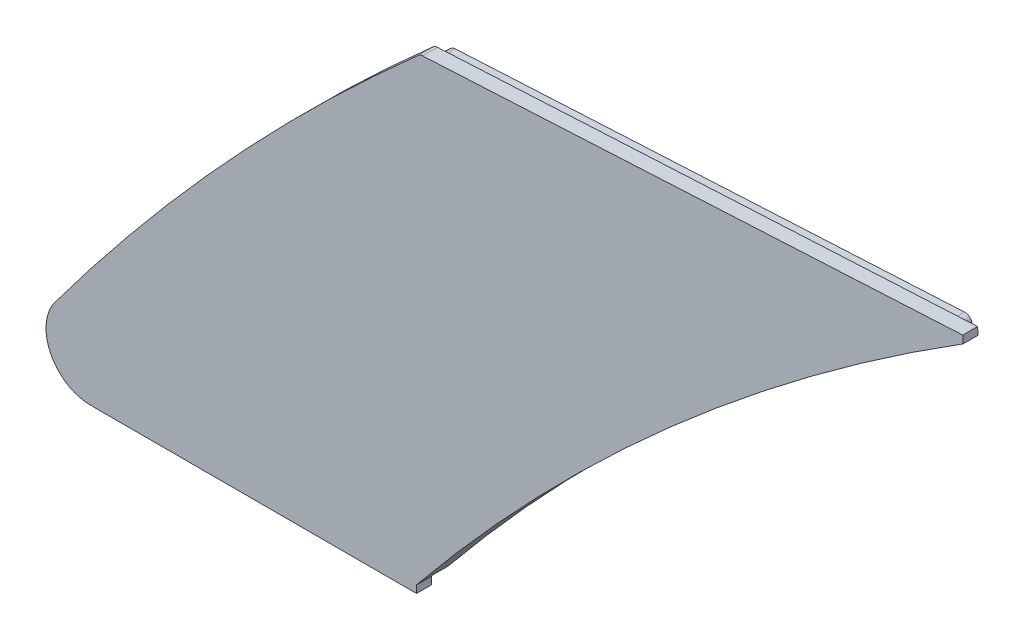
ISO-10303-21;
HEADER;
FILE_DESCRIPTION(('STEP AP214'),'2;1');
FILE_NAME('part.step','',(''),(''),'','','');
FILE_SCHEMA(('AUTOMOTIVE_DESIGN { 1 0 10303 214 1 1 1 1 }'));
ENDSEC;
DATA;
#1=APPLICATION_CONTEXT('core data for automotive mechanical design processes');
#2=APPLICATION_PROTOCOL_DEFINITION('international standard','automotive_design',2000,#1);
#3=PRODUCT_CONTEXT('',#1,'mechanical');
#4=PRODUCT('Part','Part','',(#3));
#5=PRODUCT_RELATED_PRODUCT_CATEGORY('part','',(#4));
#6=PRODUCT_DEFINITION_FORMATION('','',#4);
#7=PRODUCT_DEFINITION_CONTEXT('part definition',#1,'design');
#8=PRODUCT_DEFINITION('design','',#6,#7);
#9=PRODUCT_DEFINITION_SHAPE('','',#8);
#10=(LENGTH_UNIT() NAMED_UNIT(*) SI_UNIT(.MILLI.,.METRE.));
#11=(NAMED_UNIT(*) PLANE_ANGLE_UNIT() SI_UNIT($,.RADIAN.));
#12=(NAMED_UNIT(*) SI_UNIT($,.STERADIAN.) SOLID_ANGLE_UNIT());
#13=UNCERTAINTY_MEASURE_WITH_UNIT(LENGTH_MEASURE(1.E-05),#10,'distance_accuracy_value','');
#14=(GEOMETRIC_REPRESENTATION_CONTEXT(3) GLOBAL_UNCERTAINTY_ASSIGNED_CONTEXT((#13)) GLOBAL_UNIT_ASSIGNED_CONTEXT((#10,
#11,#12)) REPRESENTATION_CONTEXT('',''));
#15=CARTESIAN_POINT('',(0.,0.,0.));
#16=DIRECTION('',(0.,0.,1.));
#17=DIRECTION('',(1.,0.,0.));
#18=AXIS2_PLACEMENT_3D('',#15,#16,#17);
#19=CARTESIAN_POINT('',(232.70730230835,-252.33386240282,2.));
#20=DIRECTION('',(0.,0.,1.));
#21=DIRECTION('',(1.,0.,0.));
#22=AXIS2_PLACEMENT_3D('',#19,#20,#21);
#23=CYLINDRICAL_SURFACE('',#22,301.);
#24=DIRECTION('',(0.,0.,1.));
#25=VECTOR('',#24,1.);
#26=CARTESIAN_POINT('',(69.8249489380425,0.787331811631535,2.));
#27=LINE('',#26,#25);
#28=CARTESIAN_POINT('',(69.8249489380425,0.787331811631535,2.));
#29=VERTEX_POINT('',#28);
#30=CARTESIAN_POINT('',(69.8249489380425,0.787331811631535,4.));
#31=VERTEX_POINT('',#30);
#32=EDGE_CURVE('E36',#29,#31,#27,.T.);
#33=ORIENTED_EDGE('',*,*,#32,.T.);
#34=CARTESIAN_POINT('',(232.70730230835,-252.33386240282,4.));
#35=DIRECTION('',(0.,0.,-1.));
#36=DIRECTION('',(1.,0.,0.));
#37=AXIS2_PLACEMENT_3D('',#34,#35,#36);
#38=CIRCLE('',#37,301.);
#39=CARTESIAN_POINT('',(73.0381332700158,2.82639402166251,4.));
#40=VERTEX_POINT('',#39);
#41=EDGE_CURVE('E171',#31,#40,#38,.T.);
#42=ORIENTED_EDGE('',*,*,#41,.T.);
#43=DIRECTION('',(0.,0.,-1.));
#44=VECTOR('',#43,1.);
#45=CARTESIAN_POINT('',(73.0381332700158,2.82639402166251,6.));
#46=LINE('',#45,#44);
#47=CARTESIAN_POINT('',(73.0381332700158,2.82639402166251,6.));
#48=VERTEX_POINT('',#47);
#49=EDGE_CURVE('E227',#48,#40,#46,.T.);
#50=ORIENTED_EDGE('',*,*,#49,.F.);
#51=CARTESIAN_POINT('',(232.70730230835,-252.33386240282,6.));
#52=DIRECTION('',(0.,0.,-1.));
#53=DIRECTION('',(1.,0.,0.));
#54=AXIS2_PLACEMENT_3D('',#51,#52,#53);
#55=CIRCLE('',#54,301.);
#56=CARTESIAN_POINT('',(-0.475074433169964,-62.,6.));
#57=VERTEX_POINT('',#56);
#58=EDGE_CURVE('E205',#57,#48,#55,.T.);
#59=ORIENTED_EDGE('',*,*,#58,.F.);
#60=DIRECTION('',(0.,0.,-1.));
#61=VECTOR('',#60,1.);
#62=CARTESIAN_POINT('',(-0.475074433169964,-62.,6.));
#63=LINE('',#62,#61);
#64=CARTESIAN_POINT('',(-0.475074433169964,-62.,4.));
#65=VERTEX_POINT('',#64);
#66=EDGE_CURVE('E206',#57,#65,#63,.T.);
#67=ORIENTED_EDGE('',*,*,#66,.T.);
#68=CARTESIAN_POINT('',(-0.175485967712302,-61.633555835771,4.));
#69=VERTEX_POINT('',#68);
#70=EDGE_CURVE('E180',#65,#69,#38,.T.);
#71=ORIENTED_EDGE('',*,*,#70,.T.);
#72=DIRECTION('',(0.,0.,1.));
#73=VECTOR('',#72,1.);
#74=CARTESIAN_POINT('',(-0.175485967712354,-61.633555835771,2.));
#75=LINE('',#74,#73);
#76=CARTESIAN_POINT('',(-0.175485967712354,-61.633555835771,2.));
#77=VERTEX_POINT('',#76);
#78=EDGE_CURVE('E11',#77,#69,#75,.T.);
#79=ORIENTED_EDGE('',*,*,#78,.F.);
#80=CARTESIAN_POINT('',(232.70730230835,-252.33386240282,2.));
#81=DIRECTION('',(0.,0.,-1.));
#82=DIRECTION('',(1.,0.,0.));
#83=AXIS2_PLACEMENT_3D('',#80,#81,#82);
#84=CIRCLE('',#83,301.);
#85=EDGE_CURVE('E158',#77,#29,#84,.T.);
#86=ORIENTED_EDGE('',*,*,#85,.T.);
#87=EDGE_LOOP('',(#33,#42,#50,#59,#67,#71,#79,#86));
#88=FACE_BOUND('',#87,.T.);
#89=ADVANCED_FACE('F33',(#88),#23,.F.);
#90=CARTESIAN_POINT('',(-0.949182938729171,-61.,2.));
#91=DIRECTION('',(0.,0.,1.));
#92=DIRECTION('',(1.,0.,0.));
#93=AXIS2_PLACEMENT_3D('',#90,#91,#92);
#94=CYLINDRICAL_SURFACE('',#93,1.);
#95=CARTESIAN_POINT('',(-0.949182938729171,-61.,4.));
#96=DIRECTION('',(0.,0.,1.));
#97=DIRECTION('',(1.,0.,0.));
#98=AXIS2_PLACEMENT_3D('',#95,#96,#97);
#99=CIRCLE('',#98,1.);
#100=CARTESIAN_POINT('',(-0.949182938729171,-62.,4.));
#101=VERTEX_POINT('',#100);
#102=EDGE_CURVE('E156',#101,#69,#99,.T.);
#103=ORIENTED_EDGE('',*,*,#102,.F.);
#104=DIRECTION('',(0.,0.,1.));
#105=VECTOR('',#104,1.);
#106=CARTESIAN_POINT('',(-0.949182938729171,-62.,2.));
#107=LINE('',#106,#105);
#108=CARTESIAN_POINT('',(-0.949182938729171,-62.,2.));
#109=VERTEX_POINT('',#108);
#110=EDGE_CURVE('E41',#109,#101,#107,.T.);
#111=ORIENTED_EDGE('',*,*,#110,.F.);
#112=CARTESIAN_POINT('',(-0.949182938729171,-61.,2.));
#113=DIRECTION('',(0.,0.,1.));
#114=DIRECTION('',(1.,0.,0.));
#115=AXIS2_PLACEMENT_3D('',#112,#113,#114);
#116=CIRCLE('',#115,1.);
#117=EDGE_CURVE('E130',#109,#77,#116,.T.);
#118=ORIENTED_EDGE('',*,*,#117,.T.);
#119=ORIENTED_EDGE('',*,*,#78,.T.);
#120=EDGE_LOOP('',(#103,#111,#118,#119));
#121=FACE_BOUND('',#120,.T.);
#122=ADVANCED_FACE('F295',(#121),#94,.T.);
#123=CARTESIAN_POINT('',(-44.3054831138269,-62.,2.));
#124=DIRECTION('',(0.,-1.,0.));
#125=DIRECTION('',(0.,0.,-1.));
#126=AXIS2_PLACEMENT_3D('',#123,#124,#125);
#127=PLANE('',#126);
#128=DIRECTION('',(1.,0.,0.));
#129=VECTOR('',#128,1.);
#130=CARTESIAN_POINT('',(-44.3054831138269,-62.,4.));
#131=LINE('',#130,#129);
#132=CARTESIAN_POINT('',(-44.3054831138269,-62.,4.));
#133=VERTEX_POINT('',#132);
#134=EDGE_CURVE('E116',#133,#101,#131,.T.);
#135=ORIENTED_EDGE('',*,*,#134,.F.);
#136=DIRECTION('',(0.,0.,1.));
#137=VECTOR('',#136,1.);
#138=CARTESIAN_POINT('',(-44.3054831138269,-62.,2.));
#139=LINE('',#138,#137);
#140=CARTESIAN_POINT('',(-44.3054831138269,-62.,2.));
#141=VERTEX_POINT('',#140);
#142=EDGE_CURVE('E110',#141,#133,#139,.T.);
#143=ORIENTED_EDGE('',*,*,#142,.F.);
#144=DIRECTION('',(1.,0.,0.));
#145=VECTOR('',#144,1.);
#146=CARTESIAN_POINT('',(-44.3054831138269,-62.,2.));
#147=LINE('',#146,#145);
#148=EDGE_CURVE('E113',#141,#109,#147,.T.);
#149=ORIENTED_EDGE('',*,*,#148,.T.);
#150=ORIENTED_EDGE('',*,*,#110,.T.);
#151=EDGE_LOOP('',(#135,#143,#149,#150));
#152=FACE_BOUND('',#151,.T.);
#153=ADVANCED_FACE('F112',(#152),#127,.T.);
#154=CARTESIAN_POINT('',(-44.3054831138269,-57.,2.));
#155=DIRECTION('',(0.,0.,1.));
#156=DIRECTION('',(1.,0.,0.));
#157=AXIS2_PLACEMENT_3D('',#154,#155,#156);
#158=CYLINDRICAL_SURFACE('',#157,5.00000000000003);
#159=CARTESIAN_POINT('',(-44.3054831138269,-57.,4.));
#160=DIRECTION('',(0.,0.,1.));
#161=DIRECTION('',(1.,0.,0.));
#162=AXIS2_PLACEMENT_3D('',#159,#160,#161);
#163=CIRCLE('',#162,5.00000000000003);
#164=CARTESIAN_POINT('',(-48.3170422447712,-54.0154743527759,4.));
#165=VERTEX_POINT('',#164);
#166=EDGE_CURVE('E153',#165,#133,#163,.T.);
#167=ORIENTED_EDGE('',*,*,#166,.F.);
#168=DIRECTION('',(0.,0.,1.));
#169=VECTOR('',#168,1.);
#170=CARTESIAN_POINT('',(-48.3170422447712,-54.0154743527759,2.));
#171=LINE('',#170,#169);
#172=CARTESIAN_POINT('',(-48.3170422447712,-54.0154743527759,2.));
#173=VERTEX_POINT('',#172);
#174=EDGE_CURVE('E121',#173,#165,#171,.T.);
#175=ORIENTED_EDGE('',*,*,#174,.F.);
#176=CARTESIAN_POINT('',(-44.3054831138269,-57.,2.));
#177=DIRECTION('',(0.,0.,1.));
#178=DIRECTION('',(1.,0.,0.));
#179=AXIS2_PLACEMENT_3D('',#176,#177,#178);
#180=CIRCLE('',#179,5.00000000000003);
#181=EDGE_CURVE('E127',#173,#141,#180,.T.);
#182=ORIENTED_EDGE('',*,*,#181,.T.);
#183=ORIENTED_EDGE('',*,*,#142,.T.);
#184=EDGE_LOOP('',(#167,#175,#182,#183));
#185=FACE_BOUND('',#184,.T.);
#186=ADVANCED_FACE('F132',(#185),#158,.T.);
#187=CARTESIAN_POINT('',(231.689785095137,-262.335364529011,2.));
#188=DIRECTION('',(0.,0.,1.));
#189=DIRECTION('',(1.,0.,0.));
#190=AXIS2_PLACEMENT_3D('',#187,#188,#189);
#191=CYLINDRICAL_SURFACE('',#190,349.);
#192=CARTESIAN_POINT('',(231.689785095137,-262.335364529011,4.));
#193=DIRECTION('',(0.,0.,1.));
#194=DIRECTION('',(1.,0.,0.));
#195=AXIS2_PLACEMENT_3D('',#192,#193,#194);
#196=CIRCLE('',#195,349.);
#197=CARTESIAN_POINT('',(0.138825090473008,-1.21249513431716,4.));
#198=VERTEX_POINT('',#197);
#199=EDGE_CURVE('E150',#198,#165,#196,.T.);
#200=ORIENTED_EDGE('',*,*,#199,.F.);
#201=DIRECTION('',(0.,0.,1.));
#202=VECTOR('',#201,1.);
#203=CARTESIAN_POINT('',(0.138825090473008,-1.21249513431716,2.));
#204=LINE('',#203,#202);
#205=CARTESIAN_POINT('',(0.138825090473008,-1.21249513431716,2.));
#206=VERTEX_POINT('',#205);
#207=EDGE_CURVE('E162',#206,#198,#204,.T.);
#208=ORIENTED_EDGE('',*,*,#207,.F.);
#209=CARTESIAN_POINT('',(231.689785095137,-262.335364529011,2.));
#210=DIRECTION('',(0.,0.,1.));
#211=DIRECTION('',(1.,0.,0.));
#212=AXIS2_PLACEMENT_3D('',#209,#210,#211);
#213=CIRCLE('',#212,349.);
#214=EDGE_CURVE('E133',#206,#173,#213,.T.);
#215=ORIENTED_EDGE('',*,*,#214,.T.);
#216=ORIENTED_EDGE('',*,*,#174,.T.);
#217=EDGE_LOOP('',(#200,#208,#215,#216));
#218=FACE_BOUND('',#217,.T.);
#219=ADVANCED_FACE('F285',(#218),#191,.T.);
#220=CARTESIAN_POINT('',(0.802294889913291,-1.96069819848532,2.));
#221=DIRECTION('',(0.,0.,1.));
#222=DIRECTION('',(1.,0.,0.));
#223=AXIS2_PLACEMENT_3D('',#220,#221,#222);
#224=CYLINDRICAL_SURFACE('',#223,0.999999999999977);
#225=CARTESIAN_POINT('',(0.802294889913291,-1.96069819848532,4.));
#226=DIRECTION('',(0.,0.,1.));
#227=DIRECTION('',(1.,0.,0.));
#228=AXIS2_PLACEMENT_3D('',#225,#226,#227);
#229=CIRCLE('',#228,0.999999999999977);
#230=CARTESIAN_POINT('',(0.749958933670331,-0.962068663730781,4.));
#231=VERTEX_POINT('',#230);
#232=EDGE_CURVE('E147',#231,#198,#229,.T.);
#233=ORIENTED_EDGE('',*,*,#232,.F.);
#234=DIRECTION('',(0.,0.,1.));
#235=VECTOR('',#234,1.);
#236=CARTESIAN_POINT('',(0.749958933670331,-0.962068663730781,2.));
#237=LINE('',#236,#235);
#238=CARTESIAN_POINT('',(0.749958933670331,-0.962068663730781,2.));
#239=VERTEX_POINT('',#238);
#240=EDGE_CURVE('E164',#239,#231,#237,.T.);
#241=ORIENTED_EDGE('',*,*,#240,.F.);
#242=CARTESIAN_POINT('',(0.802294889913291,-1.96069819848532,2.));
#243=DIRECTION('',(0.,0.,1.));
#244=DIRECTION('',(1.,0.,0.));
#245=AXIS2_PLACEMENT_3D('',#242,#243,#244);
#246=CIRCLE('',#245,0.999999999999977);
#247=EDGE_CURVE('E135',#239,#206,#246,.T.);
#248=ORIENTED_EDGE('',*,*,#247,.T.);
#249=ORIENTED_EDGE('',*,*,#207,.T.);
#250=EDGE_LOOP('',(#233,#241,#248,#249));
#251=FACE_BOUND('',#250,.T.);
#252=ADVANCED_FACE('F279',(#251),#224,.T.);
#253=CARTESIAN_POINT('',(69.2314755951872,2.62689554643405,2.));
#254=DIRECTION('',(-0.052335956242946,0.998629534754574,0.));
#255=DIRECTION('',(-0.998629534754574,-0.052335956242946,0.));
#256=AXIS2_PLACEMENT_3D('',#253,#254,#255);
#257=PLANE('',#256);
#258=DIRECTION('',(-0.998629534754574,-0.052335956242946,0.));
#259=VECTOR('',#258,1.);
#260=CARTESIAN_POINT('',(69.2314755951872,2.62689554643405,4.));
#261=LINE('',#260,#259);
#262=CARTESIAN_POINT('',(69.2314755951872,2.62689554643402,4.));
#263=VERTEX_POINT('',#262);
#264=EDGE_CURVE('E143',#263,#231,#261,.T.);
#265=ORIENTED_EDGE('',*,*,#264,.F.);
#266=DIRECTION('',(0.,0.,1.));
#267=VECTOR('',#266,1.);
#268=CARTESIAN_POINT('',(69.2314755951872,2.62689554643402,2.));
#269=LINE('',#268,#267);
#270=CARTESIAN_POINT('',(69.2314755951872,2.62689554643402,2.));
#271=VERTEX_POINT('',#270);
#272=EDGE_CURVE('E165',#271,#263,#269,.T.);
#273=ORIENTED_EDGE('',*,*,#272,.F.);
#274=DIRECTION('',(-0.998629534754574,-0.052335956242946,0.));
#275=VECTOR('',#274,1.);
#276=CARTESIAN_POINT('',(69.2314755951872,2.62689554643405,2.));
#277=LINE('',#276,#275);
#278=EDGE_CURVE('E273',#271,#239,#277,.T.);
#279=ORIENTED_EDGE('',*,*,#278,.T.);
#280=ORIENTED_EDGE('',*,*,#240,.T.);
#281=EDGE_LOOP('',(#265,#273,#279,#280));
#282=FACE_BOUND('',#281,.T.);
#283=ADVANCED_FACE('F283',(#282),#257,.T.);
#284=CARTESIAN_POINT('',(69.2838115514302,1.6282660116795,2.));
#285=DIRECTION('',(0.,0.,1.));
#286=DIRECTION('',(1.,0.,0.));
#287=AXIS2_PLACEMENT_3D('',#284,#285,#286);
#288=CYLINDRICAL_SURFACE('',#287,0.999999999999949);
#289=CARTESIAN_POINT('',(69.2838115514302,1.6282660116795,4.));
#290=DIRECTION('',(0.,0.,1.));
#291=DIRECTION('',(1.,0.,0.));
#292=AXIS2_PLACEMENT_3D('',#289,#290,#291);
#293=CIRCLE('',#292,0.999999999999949);
#294=EDGE_CURVE('E140',#31,#263,#293,.T.);
#295=ORIENTED_EDGE('',*,*,#294,.F.);
#296=ORIENTED_EDGE('',*,*,#32,.F.);
#297=CARTESIAN_POINT('',(69.2838115514302,1.6282660116795,2.));
#298=DIRECTION('',(0.,0.,1.));
#299=DIRECTION('',(1.,0.,0.));
#300=AXIS2_PLACEMENT_3D('',#297,#298,#299);
#301=CIRCLE('',#300,0.999999999999949);
#302=EDGE_CURVE('E271',#29,#271,#301,.T.);
#303=ORIENTED_EDGE('',*,*,#302,.T.);
#304=ORIENTED_EDGE('',*,*,#272,.T.);
#305=EDGE_LOOP('',(#295,#296,#303,#304));
#306=FACE_BOUND('',#305,.T.);
#307=ADVANCED_FACE('F173',(#306),#288,.T.);
#308=CARTESIAN_POINT('',(232.70730230835,-252.33386240282,2.));
#309=DIRECTION('',(0.,0.,1.));
#310=DIRECTION('',(1.,0.,0.));
#311=AXIS2_PLACEMENT_3D('',#308,#309,#310);
#312=PLANE('',#311);
#313=DIRECTION('',(1.,0.,0.));
#314=VECTOR('',#313,1.);
#315=CARTESIAN_POINT('',(-44.3054831138269,-61.,2.));
#316=LINE('',#315,#314);
#317=CARTESIAN_POINT('',(-44.3054831138269,-61.0000000000001,2.));
#318=VERTEX_POINT('',#317);
#319=CARTESIAN_POINT('',(-0.949182938729171,-61.,2.));
#320=VERTEX_POINT('',#319);
#321=EDGE_CURVE('E241',#318,#320,#316,.T.);
#322=ORIENTED_EDGE('',*,*,#321,.T.);
#323=CARTESIAN_POINT('',(232.70730230835,-252.33386240282,2.));
#324=DIRECTION('',(0.,0.,-1.));
#325=DIRECTION('',(1.,0.,0.));
#326=AXIS2_PLACEMENT_3D('',#323,#324,#325);
#327=CIRCLE('',#326,302.);
#328=CARTESIAN_POINT('',(69.2838115514302,1.62826601167948,2.));
#329=VERTEX_POINT('',#328);
#330=EDGE_CURVE('E230',#320,#329,#327,.T.);
#331=ORIENTED_EDGE('',*,*,#330,.T.);
#332=DIRECTION('',(-0.998629534754574,-0.052335956242946,0.));
#333=VECTOR('',#332,1.);
#334=CARTESIAN_POINT('',(69.2838115514302,1.62826601167948,2.));
#335=LINE('',#334,#333);
#336=CARTESIAN_POINT('',(0.802294889913263,-1.96069819848528,2.));
#337=VERTEX_POINT('',#336);
#338=EDGE_CURVE('E233',#329,#337,#335,.T.);
#339=ORIENTED_EDGE('',*,*,#338,.T.);
#340=CARTESIAN_POINT('',(231.689785095137,-262.335364529011,2.));
#341=DIRECTION('',(0.,0.,1.));
#342=DIRECTION('',(1.,0.,0.));
#343=AXIS2_PLACEMENT_3D('',#340,#341,#342);
#344=CIRCLE('',#343,348.);
#345=CARTESIAN_POINT('',(-47.5147304185824,-54.6123794822207,2.));
#346=VERTEX_POINT('',#345);
#347=EDGE_CURVE('E49',#337,#346,#344,.T.);
#348=ORIENTED_EDGE('',*,*,#347,.T.);
#349=CARTESIAN_POINT('',(-44.3054831138269,-57.,2.));
#350=DIRECTION('',(0.,0.,1.));
#351=DIRECTION('',(1.,0.,0.));
#352=AXIS2_PLACEMENT_3D('',#349,#350,#351);
#353=CIRCLE('',#352,4.00000000000007);
#354=EDGE_CURVE('E238',#346,#318,#353,.T.);
#355=ORIENTED_EDGE('',*,*,#354,.T.);
#356=EDGE_LOOP('',(#322,#331,#339,#348,#355));
#357=FACE_BOUND('',#356,.T.);
#358=ORIENTED_EDGE('',*,*,#85,.F.);
#359=ORIENTED_EDGE('',*,*,#117,.F.);
#360=ORIENTED_EDGE('',*,*,#148,.F.);
#361=ORIENTED_EDGE('',*,*,#181,.F.);
#362=ORIENTED_EDGE('',*,*,#214,.F.);
#363=ORIENTED_EDGE('',*,*,#247,.F.);
#364=ORIENTED_EDGE('',*,*,#278,.F.);
#365=ORIENTED_EDGE('',*,*,#302,.F.);
#366=EDGE_LOOP('',(#358,#359,#360,#361,#362,#363,#364,#365));
#367=FACE_BOUND('',#366,.T.);
#368=ADVANCED_FACE('F125',(#357,#367),#312,.F.);
#369=CARTESIAN_POINT('',(232.70730230835,-252.33386240282,2.));
#370=DIRECTION('',(0.,0.,1.));
#371=DIRECTION('',(1.,0.,0.));
#372=AXIS2_PLACEMENT_3D('',#369,#370,#371);
#373=CYLINDRICAL_SURFACE('',#372,302.);
#374=CARTESIAN_POINT('',(232.70730230835,-252.33386240282,4.));
#375=DIRECTION('',(0.,0.,-1.));
#376=DIRECTION('',(1.,0.,0.));
#377=AXIS2_PLACEMENT_3D('',#374,#375,#376);
#378=CIRCLE('',#377,302.);
#379=CARTESIAN_POINT('',(-0.949182938729171,-61.,4.));
#380=VERTEX_POINT('',#379);
#381=CARTESIAN_POINT('',(69.2838115514301,1.62826601167955,4.));
#382=VERTEX_POINT('',#381);
#383=EDGE_CURVE('E229',#380,#382,#378,.T.);
#384=ORIENTED_EDGE('',*,*,#383,.T.);
#385=DIRECTION('',(0.,0.,1.));
#386=VECTOR('',#385,1.);
#387=CARTESIAN_POINT('',(69.2838115514302,1.62826601167948,2.));
#388=LINE('',#387,#386);
#389=EDGE_CURVE('E244',#329,#382,#388,.T.);
#390=ORIENTED_EDGE('',*,*,#389,.F.);
#391=ORIENTED_EDGE('',*,*,#330,.F.);
#392=DIRECTION('',(0.,0.,1.));
#393=VECTOR('',#392,1.);
#394=CARTESIAN_POINT('',(-0.949182938729171,-61.,2.));
#395=LINE('',#394,#393);
#396=EDGE_CURVE('E144',#320,#380,#395,.T.);
#397=ORIENTED_EDGE('',*,*,#396,.T.);
#398=EDGE_LOOP('',(#384,#390,#391,#397));
#399=FACE_BOUND('',#398,.T.);
#400=ADVANCED_FACE('F308',(#399),#373,.T.);
#401=CARTESIAN_POINT('',(-44.3054831138269,-61.,2.));
#402=DIRECTION('',(0.,-1.,0.));
#403=DIRECTION('',(0.,0.,-1.));
#404=AXIS2_PLACEMENT_3D('',#401,#402,#403);
#405=PLANE('',#404);
#406=DIRECTION('',(1.,0.,0.));
#407=VECTOR('',#406,1.);
#408=CARTESIAN_POINT('',(-44.3054831138269,-61.,4.));
#409=LINE('',#408,#407);
#410=CARTESIAN_POINT('',(-44.3054831138269,-61.0000000000001,4.));
#411=VERTEX_POINT('',#410);
#412=EDGE_CURVE('E234',#411,#380,#409,.T.);
#413=ORIENTED_EDGE('',*,*,#412,.T.);
#414=ORIENTED_EDGE('',*,*,#396,.F.);
#415=ORIENTED_EDGE('',*,*,#321,.F.);
#416=DIRECTION('',(0.,0.,1.));
#417=VECTOR('',#416,1.);
#418=CARTESIAN_POINT('',(-44.3054831138269,-61.0000000000001,2.));
#419=LINE('',#418,#417);
#420=EDGE_CURVE('E260',#318,#411,#419,.T.);
#421=ORIENTED_EDGE('',*,*,#420,.T.);
#422=EDGE_LOOP('',(#413,#414,#415,#421));
#423=FACE_BOUND('',#422,.T.);
#424=ADVANCED_FACE('F312',(#423),#405,.F.);
#425=CARTESIAN_POINT('',(-44.3054831138269,-57.,2.));
#426=DIRECTION('',(0.,0.,1.));
#427=DIRECTION('',(1.,0.,0.));
#428=AXIS2_PLACEMENT_3D('',#425,#426,#427);
#429=CYLINDRICAL_SURFACE('',#428,4.00000000000007);
#430=CARTESIAN_POINT('',(-44.3054831138269,-57.,4.));
#431=DIRECTION('',(0.,0.,1.));
#432=DIRECTION('',(1.,0.,0.));
#433=AXIS2_PLACEMENT_3D('',#430,#431,#432);
#434=CIRCLE('',#433,4.00000000000007);
#435=CARTESIAN_POINT('',(-47.5147304185824,-54.6123794822207,4.));
#436=VERTEX_POINT('',#435);
#437=EDGE_CURVE('E253',#436,#411,#434,.T.);
#438=ORIENTED_EDGE('',*,*,#437,.T.);
#439=ORIENTED_EDGE('',*,*,#420,.F.);
#440=ORIENTED_EDGE('',*,*,#354,.F.);
#441=DIRECTION('',(0.,0.,1.));
#442=VECTOR('',#441,1.);
#443=CARTESIAN_POINT('',(-47.5147304185824,-54.6123794822207,2.));
#444=LINE('',#443,#442);
#445=EDGE_CURVE('E263',#346,#436,#444,.T.);
#446=ORIENTED_EDGE('',*,*,#445,.T.);
#447=EDGE_LOOP('',(#438,#439,#440,#446));
#448=FACE_BOUND('',#447,.T.);
#449=ADVANCED_FACE('F321',(#448),#429,.F.);
#450=CARTESIAN_POINT('',(231.689785095137,-262.335364529011,2.));
#451=DIRECTION('',(0.,0.,1.));
#452=DIRECTION('',(1.,0.,0.));
#453=AXIS2_PLACEMENT_3D('',#450,#451,#452);
#454=CYLINDRICAL_SURFACE('',#453,348.);
#455=CARTESIAN_POINT('',(231.689785095137,-262.335364529011,4.));
#456=DIRECTION('',(0.,0.,1.));
#457=DIRECTION('',(1.,0.,0.));
#458=AXIS2_PLACEMENT_3D('',#455,#456,#457);
#459=CIRCLE('',#458,348.);
#460=CARTESIAN_POINT('',(0.802294889913263,-1.96069819848536,4.));
#461=VERTEX_POINT('',#460);
#462=EDGE_CURVE('E250',#461,#436,#459,.T.);
#463=ORIENTED_EDGE('',*,*,#462,.T.);
#464=ORIENTED_EDGE('',*,*,#445,.F.);
#465=ORIENTED_EDGE('',*,*,#347,.F.);
#466=DIRECTION('',(0.,0.,1.));
#467=VECTOR('',#466,1.);
#468=CARTESIAN_POINT('',(0.802294889913263,-1.96069819848536,2.));
#469=LINE('',#468,#467);
#470=EDGE_CURVE('E266',#337,#461,#469,.T.);
#471=ORIENTED_EDGE('',*,*,#470,.T.);
#472=EDGE_LOOP('',(#463,#464,#465,#471));
#473=FACE_BOUND('',#472,.T.);
#474=ADVANCED_FACE('F317',(#473),#454,.F.);
#475=CARTESIAN_POINT('',(69.2838115514302,1.62826601167948,2.));
#476=DIRECTION('',(-0.052335956242946,0.998629534754574,0.));
#477=DIRECTION('',(-0.998629534754574,-0.052335956242946,0.));
#478=AXIS2_PLACEMENT_3D('',#475,#476,#477);
#479=PLANE('',#478);
#480=DIRECTION('',(-0.998629534754574,-0.052335956242946,0.));
#481=VECTOR('',#480,1.);
#482=CARTESIAN_POINT('',(69.2838115514302,1.62826601167948,4.));
#483=LINE('',#482,#481);
#484=EDGE_CURVE('E247',#382,#461,#483,.T.);
#485=ORIENTED_EDGE('',*,*,#484,.T.);
#486=ORIENTED_EDGE('',*,*,#470,.F.);
#487=ORIENTED_EDGE('',*,*,#338,.F.);
#488=ORIENTED_EDGE('',*,*,#389,.T.);
#489=EDGE_LOOP('',(#485,#486,#487,#488));
#490=FACE_BOUND('',#489,.T.);
#491=ADVANCED_FACE('F314',(#490),#479,.F.);
#492=CARTESIAN_POINT('',(232.70730230835,-252.33386240282,4.));
#493=DIRECTION('',(0.,0.,1.));
#494=DIRECTION('',(1.,0.,0.));
#495=AXIS2_PLACEMENT_3D('',#492,#493,#494);
#496=PLANE('',#495);
#497=ORIENTED_EDGE('',*,*,#41,.F.);
#498=ORIENTED_EDGE('',*,*,#294,.T.);
#499=ORIENTED_EDGE('',*,*,#264,.T.);
#500=ORIENTED_EDGE('',*,*,#232,.T.);
#501=ORIENTED_EDGE('',*,*,#199,.T.);
#502=ORIENTED_EDGE('',*,*,#166,.T.);
#503=ORIENTED_EDGE('',*,*,#134,.T.);
#504=ORIENTED_EDGE('',*,*,#102,.T.);
#505=ORIENTED_EDGE('',*,*,#70,.F.);
#506=DIRECTION('',(0.,1.,0.));
#507=VECTOR('',#506,1.);
#508=CARTESIAN_POINT('',(-0.475074433169964,-63.,4.));
#509=LINE('',#508,#507);
#510=CARTESIAN_POINT('',(-0.475074433169964,-63.,4.));
#511=VERTEX_POINT('',#510);
#512=EDGE_CURVE('E202',#511,#65,#509,.T.);
#513=ORIENTED_EDGE('',*,*,#512,.F.);
#514=DIRECTION('',(1.,0.,0.));
#515=VECTOR('',#514,1.);
#516=CARTESIAN_POINT('',(-44.3054831138269,-63.,4.));
#517=LINE('',#516,#515);
#518=CARTESIAN_POINT('',(-44.3054831138269,-63.0000000000001,4.));
#519=VERTEX_POINT('',#518);
#520=EDGE_CURVE('E199',#519,#511,#517,.T.);
#521=ORIENTED_EDGE('',*,*,#520,.F.);
#522=CARTESIAN_POINT('',(-44.3054831138269,-57.,4.));
#523=DIRECTION('',(0.,0.,1.));
#524=DIRECTION('',(1.,0.,0.));
#525=AXIS2_PLACEMENT_3D('',#522,#523,#524);
#526=CIRCLE('',#525,6.00000000000008);
#527=CARTESIAN_POINT('',(-49.11935407096,-53.418569223331,4.));
#528=VERTEX_POINT('',#527);
#529=EDGE_CURVE('E196',#528,#519,#526,.T.);
#530=ORIENTED_EDGE('',*,*,#529,.F.);
#531=CARTESIAN_POINT('',(231.689785095137,-262.335364529011,4.));
#532=DIRECTION('',(0.,0.,1.));
#533=DIRECTION('',(1.,0.,0.));
#534=AXIS2_PLACEMENT_3D('',#531,#532,#533);
#535=CIRCLE('',#534,350.);
#536=CARTESIAN_POINT('',(-0.261851867654324,-0.231495594801393,4.));
#537=VERTEX_POINT('',#536);
#538=EDGE_CURVE('E193',#537,#528,#535,.T.);
#539=ORIENTED_EDGE('',*,*,#538,.F.);
#540=CARTESIAN_POINT('',(0.400867095096519,-0.980363791756268,4.));
#541=DIRECTION('',(0.,0.,1.));
#542=DIRECTION('',(1.,0.,0.));
#543=AXIS2_PLACEMENT_3D('',#540,#541,#542);
#544=CIRCLE('',#543,1.);
#545=CARTESIAN_POINT('',(0.348531138853574,0.0182657429983053,4.));
#546=VERTEX_POINT('',#545);
#547=EDGE_CURVE('E190',#546,#537,#544,.T.);
#548=ORIENTED_EDGE('',*,*,#547,.F.);
#549=DIRECTION('',(-0.998629534754574,-0.0523359562429434,0.));
#550=VECTOR('',#549,1.);
#551=CARTESIAN_POINT('',(72.9857973137728,3.82502355641695,4.));
#552=LINE('',#551,#550);
#553=CARTESIAN_POINT('',(72.9857973137728,3.82502355641695,4.));
#554=VERTEX_POINT('',#553);
#555=EDGE_CURVE('E187',#554,#546,#552,.T.);
#556=ORIENTED_EDGE('',*,*,#555,.F.);
#557=DIRECTION('',(-0.0523359562429814,0.998629534754572,0.));
#558=VECTOR('',#557,1.);
#559=CARTESIAN_POINT('',(73.0381332700158,2.82639402166251,4.));
#560=LINE('',#559,#558);
#561=EDGE_CURVE('E178',#40,#554,#560,.T.);
#562=ORIENTED_EDGE('',*,*,#561,.F.);
#563=EDGE_LOOP('',(#497,#498,#499,#500,#501,#502,#503,#504,#505,#513,#521,#530,#539,#548,#556,#562));
#564=FACE_BOUND('',#563,.T.);
#565=ADVANCED_FACE('F175',(#564),#496,.F.);
#566=CARTESIAN_POINT('',(232.70730230835,-252.33386240282,6.));
#567=DIRECTION('',(0.,0.,1.));
#568=DIRECTION('',(1.,0.,0.));
#569=AXIS2_PLACEMENT_3D('',#566,#567,#568);
#570=PLANE('',#569);
#571=ORIENTED_EDGE('',*,*,#58,.T.);
#572=DIRECTION('',(-0.0523359562429814,0.998629534754572,0.));
#573=VECTOR('',#572,1.);
#574=CARTESIAN_POINT('',(73.0381332700158,2.82639402166251,6.));
#575=LINE('',#574,#573);
#576=CARTESIAN_POINT('',(72.9857973137728,3.82502355641695,6.));
#577=VERTEX_POINT('',#576);
#578=EDGE_CURVE('E372',#48,#577,#575,.T.);
#579=ORIENTED_EDGE('',*,*,#578,.T.);
#580=DIRECTION('',(-0.998629534754574,-0.0523359562429434,0.));
#581=VECTOR('',#580,1.);
#582=CARTESIAN_POINT('',(72.9857973137728,3.82502355641695,6.));
#583=LINE('',#582,#581);
#584=CARTESIAN_POINT('',(0.348531138853574,0.0182657429983053,6.));
#585=VERTEX_POINT('',#584);
#586=EDGE_CURVE('E586',#577,#585,#583,.T.);
#587=ORIENTED_EDGE('',*,*,#586,.T.);
#588=CARTESIAN_POINT('',(0.400867095096519,-0.980363791756268,6.));
#589=DIRECTION('',(0.,0.,1.));
#590=DIRECTION('',(1.,0.,0.));
#591=AXIS2_PLACEMENT_3D('',#588,#589,#590);
#592=CIRCLE('',#591,1.);
#593=CARTESIAN_POINT('',(-0.261851867654324,-0.231495594801393,6.));
#594=VERTEX_POINT('',#593);
#595=EDGE_CURVE('E589',#585,#594,#592,.T.);
#596=ORIENTED_EDGE('',*,*,#595,.T.);
#597=CARTESIAN_POINT('',(231.689785095137,-262.335364529011,6.));
#598=DIRECTION('',(0.,0.,1.));
#599=DIRECTION('',(1.,0.,0.));
#600=AXIS2_PLACEMENT_3D('',#597,#598,#599);
#601=CIRCLE('',#600,350.);
#602=CARTESIAN_POINT('',(-49.11935407096,-53.418569223331,6.));
#603=VERTEX_POINT('',#602);
#604=EDGE_CURVE('E594',#594,#603,#601,.T.);
#605=ORIENTED_EDGE('',*,*,#604,.T.);
#606=CARTESIAN_POINT('',(-44.3054831138269,-57.,6.));
#607=DIRECTION('',(0.,0.,1.));
#608=DIRECTION('',(1.,0.,0.));
#609=AXIS2_PLACEMENT_3D('',#606,#607,#608);
#610=CIRCLE('',#609,6.00000000000008);
#611=CARTESIAN_POINT('',(-44.3054831138269,-63.0000000000001,6.));
#612=VERTEX_POINT('',#611);
#613=EDGE_CURVE('E596',#603,#612,#610,.T.);
#614=ORIENTED_EDGE('',*,*,#613,.T.);
#615=DIRECTION('',(1.,0.,0.));
#616=VECTOR('',#615,1.);
#617=CARTESIAN_POINT('',(-44.3054831138269,-63.,6.));
#618=LINE('',#617,#616);
#619=CARTESIAN_POINT('',(-0.475074433169964,-63.,6.));
#620=VERTEX_POINT('',#619);
#621=EDGE_CURVE('E573',#612,#620,#618,.T.);
#622=ORIENTED_EDGE('',*,*,#621,.T.);
#623=DIRECTION('',(0.,1.,0.));
#624=VECTOR('',#623,1.);
#625=CARTESIAN_POINT('',(-0.475074433169964,-63.,6.));
#626=LINE('',#625,#624);
#627=EDGE_CURVE('E184',#620,#57,#626,.T.);
#628=ORIENTED_EDGE('',*,*,#627,.T.);
#629=EDGE_LOOP('',(#571,#579,#587,#596,#605,#614,#622,#628));
#630=FACE_BOUND('',#629,.T.);
#631=ADVANCED_FACE('F356',(#630),#570,.T.);
#632=CARTESIAN_POINT('',(-0.475074433169964,-63.,6.));
#633=DIRECTION('',(-1.,0.,0.));
#634=DIRECTION('',(0.,-1.,0.));
#635=AXIS2_PLACEMENT_3D('',#632,#633,#634);
#636=PLANE('',#635);
#637=ORIENTED_EDGE('',*,*,#512,.T.);
#638=ORIENTED_EDGE('',*,*,#66,.F.);
#639=ORIENTED_EDGE('',*,*,#627,.F.);
#640=DIRECTION('',(0.,0.,-1.));
#641=VECTOR('',#640,1.);
#642=CARTESIAN_POINT('',(-0.475074433169964,-63.,6.));
#643=LINE('',#642,#641);
#644=EDGE_CURVE('E209',#620,#511,#643,.T.);
#645=ORIENTED_EDGE('',*,*,#644,.T.);
#646=EDGE_LOOP('',(#637,#638,#639,#645));
#647=FACE_BOUND('',#646,.T.);
#648=ADVANCED_FACE('F352',(#647),#636,.F.);
#649=CARTESIAN_POINT('',(-44.3054831138269,-63.,6.));
#650=DIRECTION('',(0.,1.,0.));
#651=DIRECTION('',(-1.,0.,0.));
#652=AXIS2_PLACEMENT_3D('',#649,#650,#651);
#653=PLANE('',#652);
#654=ORIENTED_EDGE('',*,*,#520,.T.);
#655=ORIENTED_EDGE('',*,*,#644,.F.);
#656=ORIENTED_EDGE('',*,*,#621,.F.);
#657=DIRECTION('',(0.,0.,-1.));
#658=VECTOR('',#657,1.);
#659=CARTESIAN_POINT('',(-44.3054831138269,-63.0000000000001,6.));
#660=LINE('',#659,#658);
#661=EDGE_CURVE('E212',#612,#519,#660,.T.);
#662=ORIENTED_EDGE('',*,*,#661,.T.);
#663=EDGE_LOOP('',(#654,#655,#656,#662));
#664=FACE_BOUND('',#663,.T.);
#665=ADVANCED_FACE('F348',(#664),#653,.F.);
#666=CARTESIAN_POINT('',(-44.3054831138269,-57.,6.));
#667=DIRECTION('',(0.,0.,-1.));
#668=DIRECTION('',(-1.,0.,0.));
#669=AXIS2_PLACEMENT_3D('',#666,#667,#668);
#670=CYLINDRICAL_SURFACE('',#669,6.00000000000008);
#671=ORIENTED_EDGE('',*,*,#529,.T.);
#672=ORIENTED_EDGE('',*,*,#661,.F.);
#673=ORIENTED_EDGE('',*,*,#613,.F.);
#674=DIRECTION('',(0.,0.,-1.));
#675=VECTOR('',#674,1.);
#676=CARTESIAN_POINT('',(-49.11935407096,-53.418569223331,6.));
#677=LINE('',#676,#675);
#678=EDGE_CURVE('E215',#603,#528,#677,.T.);
#679=ORIENTED_EDGE('',*,*,#678,.T.);
#680=EDGE_LOOP('',(#671,#672,#673,#679));
#681=FACE_BOUND('',#680,.T.);
#682=ADVANCED_FACE('F344',(#681),#670,.T.);
#683=CARTESIAN_POINT('',(231.689785095137,-262.335364529011,6.));
#684=DIRECTION('',(0.,0.,-1.));
#685=DIRECTION('',(-1.,0.,0.));
#686=AXIS2_PLACEMENT_3D('',#683,#684,#685);
#687=CYLINDRICAL_SURFACE('',#686,350.);
#688=ORIENTED_EDGE('',*,*,#538,.T.);
#689=ORIENTED_EDGE('',*,*,#678,.F.);
#690=ORIENTED_EDGE('',*,*,#604,.F.);
#691=DIRECTION('',(0.,0.,-1.));
#692=VECTOR('',#691,1.);
#693=CARTESIAN_POINT('',(-0.261851867654324,-0.231495594801393,6.));
#694=LINE('',#693,#692);
#695=EDGE_CURVE('E218',#594,#537,#694,.T.);
#696=ORIENTED_EDGE('',*,*,#695,.T.);
#697=EDGE_LOOP('',(#688,#689,#690,#696));
#698=FACE_BOUND('',#697,.T.);
#699=ADVANCED_FACE('F340',(#698),#687,.T.);
#700=CARTESIAN_POINT('',(0.400867095096519,-0.980363791756268,6.));
#701=DIRECTION('',(0.,0.,-1.));
#702=DIRECTION('',(-1.,0.,0.));
#703=AXIS2_PLACEMENT_3D('',#700,#701,#702);
#704=CYLINDRICAL_SURFACE('',#703,1.);
#705=ORIENTED_EDGE('',*,*,#547,.T.);
#706=ORIENTED_EDGE('',*,*,#695,.F.);
#707=ORIENTED_EDGE('',*,*,#595,.F.);
#708=DIRECTION('',(0.,0.,-1.));
#709=VECTOR('',#708,1.);
#710=CARTESIAN_POINT('',(0.348531138853574,0.0182657429983053,6.));
#711=LINE('',#710,#709);
#712=EDGE_CURVE('E221',#585,#546,#711,.T.);
#713=ORIENTED_EDGE('',*,*,#712,.T.);
#714=EDGE_LOOP('',(#705,#706,#707,#713));
#715=FACE_BOUND('',#714,.T.);
#716=ADVANCED_FACE('F336',(#715),#704,.T.);
#717=CARTESIAN_POINT('',(72.9857973137728,3.82502355641695,6.));
#718=DIRECTION('',(0.0523359562429434,-0.998629534754574,0.));
#719=DIRECTION('',(0.998629534754574,0.0523359562429434,0.));
#720=AXIS2_PLACEMENT_3D('',#717,#718,#719);
#721=PLANE('',#720);
#722=ORIENTED_EDGE('',*,*,#555,.T.);
#723=ORIENTED_EDGE('',*,*,#712,.F.);
#724=ORIENTED_EDGE('',*,*,#586,.F.);
#725=DIRECTION('',(0.,0.,-1.));
#726=VECTOR('',#725,1.);
#727=CARTESIAN_POINT('',(72.9857973137728,3.82502355641695,6.));
#728=LINE('',#727,#726);
#729=EDGE_CURVE('E224',#577,#554,#728,.T.);
#730=ORIENTED_EDGE('',*,*,#729,.T.);
#731=EDGE_LOOP('',(#722,#723,#724,#730));
#732=FACE_BOUND('',#731,.T.);
#733=ADVANCED_FACE('F332',(#732),#721,.F.);
#734=CARTESIAN_POINT('',(73.0381332700158,2.82639402166251,6.));
#735=DIRECTION('',(-0.998629534754572,-0.0523359562429814,0.));
#736=DIRECTION('',(0.0523359562429814,-0.998629534754572,0.));
#737=AXIS2_PLACEMENT_3D('',#734,#735,#736);
#738=PLANE('',#737);
#739=ORIENTED_EDGE('',*,*,#561,.T.);
#740=ORIENTED_EDGE('',*,*,#729,.F.);
#741=ORIENTED_EDGE('',*,*,#578,.F.);
#742=ORIENTED_EDGE('',*,*,#49,.T.);
#743=EDGE_LOOP('',(#739,#740,#741,#742));
#744=FACE_BOUND('',#743,.T.);
#745=ADVANCED_FACE('F328',(#744),#738,.F.);
#746=ORIENTED_EDGE('',*,*,#383,.F.);
#747=ORIENTED_EDGE('',*,*,#412,.F.);
#748=ORIENTED_EDGE('',*,*,#437,.F.);
#749=ORIENTED_EDGE('',*,*,#462,.F.);
#750=ORIENTED_EDGE('',*,*,#484,.F.);
#751=EDGE_LOOP('',(#746,#747,#748,#749,#750));
#752=FACE_BOUND('',#751,.T.);
#753=ADVANCED_FACE('F331',(#752),#496,.F.);
#754=CLOSED_SHELL('',(#89,#122,#153,#186,#219,#252,#283,#307,#368,#400,#424,#449,#474,#491,#565,
#631,#648,#665,#682,#699,#716,#733,#745,#753));
#755=MANIFOLD_SOLID_BREP('B2',#754);
#756=ADVANCED_BREP_SHAPE_REPRESENTATION('',(#18,#755),#14);
#757=SHAPE_DEFINITION_REPRESENTATION(#9,#756);
ENDSEC;
END-ISO-10303-21;
